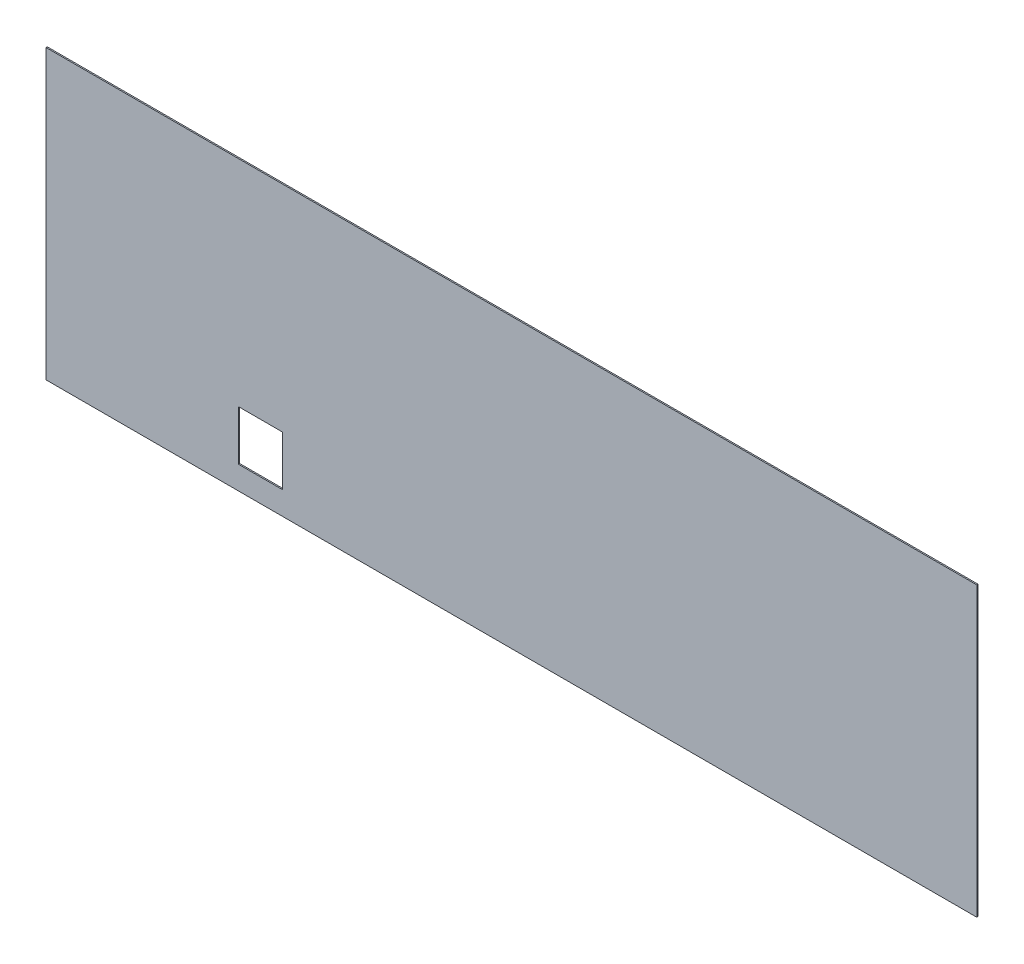
ISO-10303-21;
HEADER;
FILE_DESCRIPTION(('STEP AP214'),'2;1');
FILE_NAME('part.step','',(''),(''),'','','');
FILE_SCHEMA(('AUTOMOTIVE_DESIGN { 1 0 10303 214 1 1 1 1 }'));
ENDSEC;
DATA;
#1=APPLICATION_CONTEXT('core data for automotive mechanical design processes');
#2=APPLICATION_PROTOCOL_DEFINITION('international standard','automotive_design',2000,#1);
#3=PRODUCT_CONTEXT('',#1,'mechanical');
#4=PRODUCT('Part','Part','',(#3));
#5=PRODUCT_RELATED_PRODUCT_CATEGORY('part','',(#4));
#6=PRODUCT_DEFINITION_FORMATION('','',#4);
#7=PRODUCT_DEFINITION_CONTEXT('part definition',#1,'design');
#8=PRODUCT_DEFINITION('design','',#6,#7);
#9=PRODUCT_DEFINITION_SHAPE('','',#8);
#10=(LENGTH_UNIT() NAMED_UNIT(*) SI_UNIT(.MILLI.,.METRE.));
#11=(NAMED_UNIT(*) PLANE_ANGLE_UNIT() SI_UNIT($,.RADIAN.));
#12=(NAMED_UNIT(*) SI_UNIT($,.STERADIAN.) SOLID_ANGLE_UNIT());
#13=UNCERTAINTY_MEASURE_WITH_UNIT(LENGTH_MEASURE(1.E-05),#10,'distance_accuracy_value','');
#14=(GEOMETRIC_REPRESENTATION_CONTEXT(3) GLOBAL_UNCERTAINTY_ASSIGNED_CONTEXT((#13)) GLOBAL_UNIT_ASSIGNED_CONTEXT((#10,
#11,#12)) REPRESENTATION_CONTEXT('',''));
#15=CARTESIAN_POINT('',(0.,0.,0.));
#16=DIRECTION('',(0.,0.,1.));
#17=DIRECTION('',(1.,0.,0.));
#18=AXIS2_PLACEMENT_3D('',#15,#16,#17);
#19=CARTESIAN_POINT('',(0.,0.,1.));
#20=DIRECTION('',(1.,0.,0.));
#21=DIRECTION('',(0.,0.,-1.));
#22=AXIS2_PLACEMENT_3D('',#19,#20,#21);
#23=PLANE('',#22);
#24=DIRECTION('',(0.,-1.,0.));
#25=VECTOR('',#24,1.);
#26=CARTESIAN_POINT('',(0.,0.,0.));
#27=LINE('',#26,#25);
#28=CARTESIAN_POINT('',(0.,231.,0.));
#29=VERTEX_POINT('',#28);
#30=CARTESIAN_POINT('',(0.,0.,0.));
#31=VERTEX_POINT('',#30);
#32=EDGE_CURVE('E133',#29,#31,#27,.T.);
#33=ORIENTED_EDGE('',*,*,#32,.T.);
#34=DIRECTION('',(0.,0.,-1.));
#35=VECTOR('',#34,1.);
#36=CARTESIAN_POINT('',(0.,0.,1.));
#37=LINE('',#36,#35);
#38=CARTESIAN_POINT('',(0.,0.,1.));
#39=VERTEX_POINT('',#38);
#40=EDGE_CURVE('E11',#39,#31,#37,.T.);
#41=ORIENTED_EDGE('',*,*,#40,.F.);
#42=DIRECTION('',(0.,-1.,0.));
#43=VECTOR('',#42,1.);
#44=CARTESIAN_POINT('',(0.,0.,1.));
#45=LINE('',#44,#43);
#46=CARTESIAN_POINT('',(0.,231.,1.));
#47=VERTEX_POINT('',#46);
#48=EDGE_CURVE('E134',#47,#39,#45,.T.);
#49=ORIENTED_EDGE('',*,*,#48,.F.);
#50=DIRECTION('',(0.,0.,-1.));
#51=VECTOR('',#50,1.);
#52=CARTESIAN_POINT('',(0.,231.,1.));
#53=LINE('',#52,#51);
#54=EDGE_CURVE('E144',#47,#29,#53,.T.);
#55=ORIENTED_EDGE('',*,*,#54,.T.);
#56=EDGE_LOOP('',(#33,#41,#49,#55));
#57=FACE_BOUND('',#56,.T.);
#58=ADVANCED_FACE('F32',(#57),#23,.F.);
#59=CARTESIAN_POINT('',(0.,0.,1.));
#60=DIRECTION('',(0.,1.,0.));
#61=DIRECTION('',(0.,0.,1.));
#62=AXIS2_PLACEMENT_3D('',#59,#60,#61);
#63=PLANE('',#62);
#64=DIRECTION('',(1.,0.,0.));
#65=VECTOR('',#64,1.);
#66=CARTESIAN_POINT('',(0.,0.,0.));
#67=LINE('',#66,#65);
#68=CARTESIAN_POINT('',(747.,0.,0.));
#69=VERTEX_POINT('',#68);
#70=EDGE_CURVE('E147',#31,#69,#67,.T.);
#71=ORIENTED_EDGE('',*,*,#70,.T.);
#72=DIRECTION('',(0.,0.,-1.));
#73=VECTOR('',#72,1.);
#74=CARTESIAN_POINT('',(747.,0.,1.));
#75=LINE('',#74,#73);
#76=CARTESIAN_POINT('',(747.,0.,1.));
#77=VERTEX_POINT('',#76);
#78=EDGE_CURVE('E39',#77,#69,#75,.T.);
#79=ORIENTED_EDGE('',*,*,#78,.F.);
#80=DIRECTION('',(1.,0.,0.));
#81=VECTOR('',#80,1.);
#82=CARTESIAN_POINT('',(0.,0.,1.));
#83=LINE('',#82,#81);
#84=EDGE_CURVE('E137',#39,#77,#83,.T.);
#85=ORIENTED_EDGE('',*,*,#84,.F.);
#86=ORIENTED_EDGE('',*,*,#40,.T.);
#87=EDGE_LOOP('',(#71,#79,#85,#86));
#88=FACE_BOUND('',#87,.T.);
#89=ADVANCED_FACE('F175',(#88),#63,.F.);
#90=CARTESIAN_POINT('',(747.,0.,1.));
#91=DIRECTION('',(-1.,0.,0.));
#92=DIRECTION('',(0.,0.,1.));
#93=AXIS2_PLACEMENT_3D('',#90,#91,#92);
#94=PLANE('',#93);
#95=DIRECTION('',(0.,1.,0.));
#96=VECTOR('',#95,1.);
#97=CARTESIAN_POINT('',(747.,0.,0.));
#98=LINE('',#97,#96);
#99=CARTESIAN_POINT('',(747.,231.,0.));
#100=VERTEX_POINT('',#99);
#101=EDGE_CURVE('E149',#69,#100,#98,.T.);
#102=ORIENTED_EDGE('',*,*,#101,.T.);
#103=DIRECTION('',(0.,0.,-1.));
#104=VECTOR('',#103,1.);
#105=CARTESIAN_POINT('',(747.,231.,1.));
#106=LINE('',#105,#104);
#107=CARTESIAN_POINT('',(747.,231.,1.));
#108=VERTEX_POINT('',#107);
#109=EDGE_CURVE('E154',#108,#100,#106,.T.);
#110=ORIENTED_EDGE('',*,*,#109,.F.);
#111=DIRECTION('',(0.,1.,0.));
#112=VECTOR('',#111,1.);
#113=CARTESIAN_POINT('',(747.,0.,1.));
#114=LINE('',#113,#112);
#115=EDGE_CURVE('E140',#77,#108,#114,.T.);
#116=ORIENTED_EDGE('',*,*,#115,.F.);
#117=ORIENTED_EDGE('',*,*,#78,.T.);
#118=EDGE_LOOP('',(#102,#110,#116,#117));
#119=FACE_BOUND('',#118,.T.);
#120=ADVANCED_FACE('F161',(#119),#94,.F.);
#121=CARTESIAN_POINT('',(0.,231.,1.));
#122=DIRECTION('',(0.,-1.,0.));
#123=DIRECTION('',(0.,0.,-1.));
#124=AXIS2_PLACEMENT_3D('',#121,#122,#123);
#125=PLANE('',#124);
#126=DIRECTION('',(-1.,0.,0.));
#127=VECTOR('',#126,1.);
#128=CARTESIAN_POINT('',(0.,231.,0.));
#129=LINE('',#128,#127);
#130=EDGE_CURVE('E138',#100,#29,#129,.T.);
#131=ORIENTED_EDGE('',*,*,#130,.T.);
#132=ORIENTED_EDGE('',*,*,#54,.F.);
#133=DIRECTION('',(-1.,0.,0.));
#134=VECTOR('',#133,1.);
#135=CARTESIAN_POINT('',(0.,231.,1.));
#136=LINE('',#135,#134);
#137=EDGE_CURVE('E142',#108,#47,#136,.T.);
#138=ORIENTED_EDGE('',*,*,#137,.F.);
#139=ORIENTED_EDGE('',*,*,#109,.T.);
#140=EDGE_LOOP('',(#131,#132,#138,#139));
#141=FACE_BOUND('',#140,.T.);
#142=ADVANCED_FACE('F168',(#141),#125,.F.);
#143=CARTESIAN_POINT('',(0.,0.,1.));
#144=DIRECTION('',(0.,0.,-1.));
#145=DIRECTION('',(-1.,0.,0.));
#146=AXIS2_PLACEMENT_3D('',#143,#144,#145);
#147=PLANE('',#146);
#148=DIRECTION('',(1.,0.,0.));
#149=VECTOR('',#148,1.);
#150=CARTESIAN_POINT('',(0.,58.6218987764884,1.));
#151=LINE('',#150,#149);
#152=CARTESIAN_POINT('',(154.380105722062,58.6218987764884,0.999999999999999));
#153=VERTEX_POINT('',#152);
#154=CARTESIAN_POINT('',(189.762459013288,58.6218987764884,0.999999999999999));
#155=VERTEX_POINT('',#154);
#156=EDGE_CURVE('E127',#153,#155,#151,.T.);
#157=ORIENTED_EDGE('',*,*,#156,.T.);
#158=DIRECTION('',(0.,-1.,0.));
#159=VECTOR('',#158,1.);
#160=CARTESIAN_POINT('',(189.762459013288,0.,1.));
#161=LINE('',#160,#159);
#162=CARTESIAN_POINT('',(189.762459013288,18.5803735913286,0.999999999999999));
#163=VERTEX_POINT('',#162);
#164=EDGE_CURVE('E130',#155,#163,#161,.T.);
#165=ORIENTED_EDGE('',*,*,#164,.T.);
#166=DIRECTION('',(-1.,0.,0.));
#167=VECTOR('',#166,1.);
#168=CARTESIAN_POINT('',(0.,18.5803735913286,1.));
#169=LINE('',#168,#167);
#170=CARTESIAN_POINT('',(154.380105722062,18.5803735913286,1.));
#171=VERTEX_POINT('',#170);
#172=EDGE_CURVE('E122',#163,#171,#169,.T.);
#173=ORIENTED_EDGE('',*,*,#172,.T.);
#174=DIRECTION('',(0.,1.,0.));
#175=VECTOR('',#174,1.);
#176=CARTESIAN_POINT('',(154.380105722062,0.,1.));
#177=LINE('',#176,#175);
#178=EDGE_CURVE('E102',#171,#153,#177,.T.);
#179=ORIENTED_EDGE('',*,*,#178,.T.);
#180=EDGE_LOOP('',(#157,#165,#173,#179));
#181=FACE_BOUND('',#180,.T.);
#182=ORIENTED_EDGE('',*,*,#48,.T.);
#183=ORIENTED_EDGE('',*,*,#84,.T.);
#184=ORIENTED_EDGE('',*,*,#115,.T.);
#185=ORIENTED_EDGE('',*,*,#137,.T.);
#186=EDGE_LOOP('',(#182,#183,#184,#185));
#187=FACE_BOUND('',#186,.T.);
#188=ADVANCED_FACE('F174',(#181,#187),#147,.F.);
#189=CARTESIAN_POINT('',(0.,0.,0.));
#190=DIRECTION('',(0.,0.,-1.));
#191=DIRECTION('',(-1.,0.,0.));
#192=AXIS2_PLACEMENT_3D('',#189,#190,#191);
#193=PLANE('',#192);
#194=DIRECTION('',(0.,-1.,0.));
#195=VECTOR('',#194,1.);
#196=CARTESIAN_POINT('',(189.762459013288,58.6218987764884,0.));
#197=LINE('',#196,#195);
#198=CARTESIAN_POINT('',(189.762459013288,58.6218987764884,0.));
#199=VERTEX_POINT('',#198);
#200=CARTESIAN_POINT('',(189.762459013288,18.5803735913286,0.));
#201=VERTEX_POINT('',#200);
#202=EDGE_CURVE('E54',#199,#201,#197,.T.);
#203=ORIENTED_EDGE('',*,*,#202,.F.);
#204=DIRECTION('',(1.,0.,0.));
#205=VECTOR('',#204,1.);
#206=CARTESIAN_POINT('',(189.762459013288,58.6218987764884,0.));
#207=LINE('',#206,#205);
#208=CARTESIAN_POINT('',(154.380105722062,58.6218987764884,0.));
#209=VERTEX_POINT('',#208);
#210=EDGE_CURVE('E115',#209,#199,#207,.T.);
#211=ORIENTED_EDGE('',*,*,#210,.F.);
#212=DIRECTION('',(0.,1.,0.));
#213=VECTOR('',#212,1.);
#214=CARTESIAN_POINT('',(154.380105722062,58.6218987764884,0.));
#215=LINE('',#214,#213);
#216=CARTESIAN_POINT('',(154.380105722062,18.5803735913286,0.));
#217=VERTEX_POINT('',#216);
#218=EDGE_CURVE('E99',#217,#209,#215,.T.);
#219=ORIENTED_EDGE('',*,*,#218,.F.);
#220=DIRECTION('',(-1.,0.,0.));
#221=VECTOR('',#220,1.);
#222=CARTESIAN_POINT('',(189.762459013288,18.5803735913286,0.));
#223=LINE('',#222,#221);
#224=EDGE_CURVE('E108',#201,#217,#223,.T.);
#225=ORIENTED_EDGE('',*,*,#224,.F.);
#226=EDGE_LOOP('',(#203,#211,#219,#225));
#227=FACE_BOUND('',#226,.T.);
#228=ORIENTED_EDGE('',*,*,#32,.F.);
#229=ORIENTED_EDGE('',*,*,#130,.F.);
#230=ORIENTED_EDGE('',*,*,#101,.F.);
#231=ORIENTED_EDGE('',*,*,#70,.F.);
#232=EDGE_LOOP('',(#228,#229,#230,#231));
#233=FACE_BOUND('',#232,.T.);
#234=ADVANCED_FACE('F112',(#227,#233),#193,.T.);
#235=CARTESIAN_POINT('',(189.762459013288,58.6218987764884,10.));
#236=DIRECTION('',(1.,0.,0.));
#237=DIRECTION('',(0.,0.,-1.));
#238=AXIS2_PLACEMENT_3D('',#235,#236,#237);
#239=PLANE('',#238);
#240=DIRECTION('',(0.,0.,-1.));
#241=VECTOR('',#240,1.);
#242=CARTESIAN_POINT('',(189.762459013288,58.6218987764884,10.));
#243=LINE('',#242,#241);
#244=EDGE_CURVE('E120',#155,#199,#243,.T.);
#245=ORIENTED_EDGE('',*,*,#244,.T.);
#246=ORIENTED_EDGE('',*,*,#202,.T.);
#247=DIRECTION('',(0.,0.,-1.));
#248=VECTOR('',#247,1.);
#249=CARTESIAN_POINT('',(189.762459013288,18.5803735913286,10.));
#250=LINE('',#249,#248);
#251=EDGE_CURVE('E105',#163,#201,#250,.T.);
#252=ORIENTED_EDGE('',*,*,#251,.F.);
#253=ORIENTED_EDGE('',*,*,#164,.F.);
#254=EDGE_LOOP('',(#245,#246,#252,#253));
#255=FACE_BOUND('',#254,.T.);
#256=ADVANCED_FACE('F187',(#255),#239,.F.);
#257=CARTESIAN_POINT('',(189.762459013288,58.6218987764884,10.));
#258=DIRECTION('',(0.,1.,0.));
#259=DIRECTION('',(0.,0.,1.));
#260=AXIS2_PLACEMENT_3D('',#257,#258,#259);
#261=PLANE('',#260);
#262=DIRECTION('',(0.,0.,-1.));
#263=VECTOR('',#262,1.);
#264=CARTESIAN_POINT('',(154.380105722062,58.6218987764884,10.));
#265=LINE('',#264,#263);
#266=EDGE_CURVE('E104',#153,#209,#265,.T.);
#267=ORIENTED_EDGE('',*,*,#266,.T.);
#268=ORIENTED_EDGE('',*,*,#210,.T.);
#269=ORIENTED_EDGE('',*,*,#244,.F.);
#270=ORIENTED_EDGE('',*,*,#156,.F.);
#271=EDGE_LOOP('',(#267,#268,#269,#270));
#272=FACE_BOUND('',#271,.T.);
#273=ADVANCED_FACE('F193',(#272),#261,.F.);
#274=CARTESIAN_POINT('',(154.380105722062,58.6218987764884,10.));
#275=DIRECTION('',(-1.,0.,0.));
#276=DIRECTION('',(0.,0.,1.));
#277=AXIS2_PLACEMENT_3D('',#274,#275,#276);
#278=PLANE('',#277);
#279=DIRECTION('',(0.,0.,-1.));
#280=VECTOR('',#279,1.);
#281=CARTESIAN_POINT('',(154.380105722062,18.5803735913286,10.));
#282=LINE('',#281,#280);
#283=EDGE_CURVE('E46',#171,#217,#282,.T.);
#284=ORIENTED_EDGE('',*,*,#283,.T.);
#285=ORIENTED_EDGE('',*,*,#218,.T.);
#286=ORIENTED_EDGE('',*,*,#266,.F.);
#287=ORIENTED_EDGE('',*,*,#178,.F.);
#288=EDGE_LOOP('',(#284,#285,#286,#287));
#289=FACE_BOUND('',#288,.T.);
#290=ADVANCED_FACE('F96',(#289),#278,.F.);
#291=CARTESIAN_POINT('',(189.762459013288,18.5803735913286,10.));
#292=DIRECTION('',(0.,-1.,0.));
#293=DIRECTION('',(0.,0.,-1.));
#294=AXIS2_PLACEMENT_3D('',#291,#292,#293);
#295=PLANE('',#294);
#296=ORIENTED_EDGE('',*,*,#251,.T.);
#297=ORIENTED_EDGE('',*,*,#224,.T.);
#298=ORIENTED_EDGE('',*,*,#283,.F.);
#299=ORIENTED_EDGE('',*,*,#172,.F.);
#300=EDGE_LOOP('',(#296,#297,#298,#299));
#301=FACE_BOUND('',#300,.T.);
#302=ADVANCED_FACE('F109',(#301),#295,.F.);
#303=CLOSED_SHELL('',(#58,#89,#120,#142,#188,#234,#256,#273,#290,#302));
#304=MANIFOLD_SOLID_BREP('B2',#303);
#305=ADVANCED_BREP_SHAPE_REPRESENTATION('',(#18,#304),#14);
#306=SHAPE_DEFINITION_REPRESENTATION(#9,#305);
ENDSEC;
END-ISO-10303-21;
